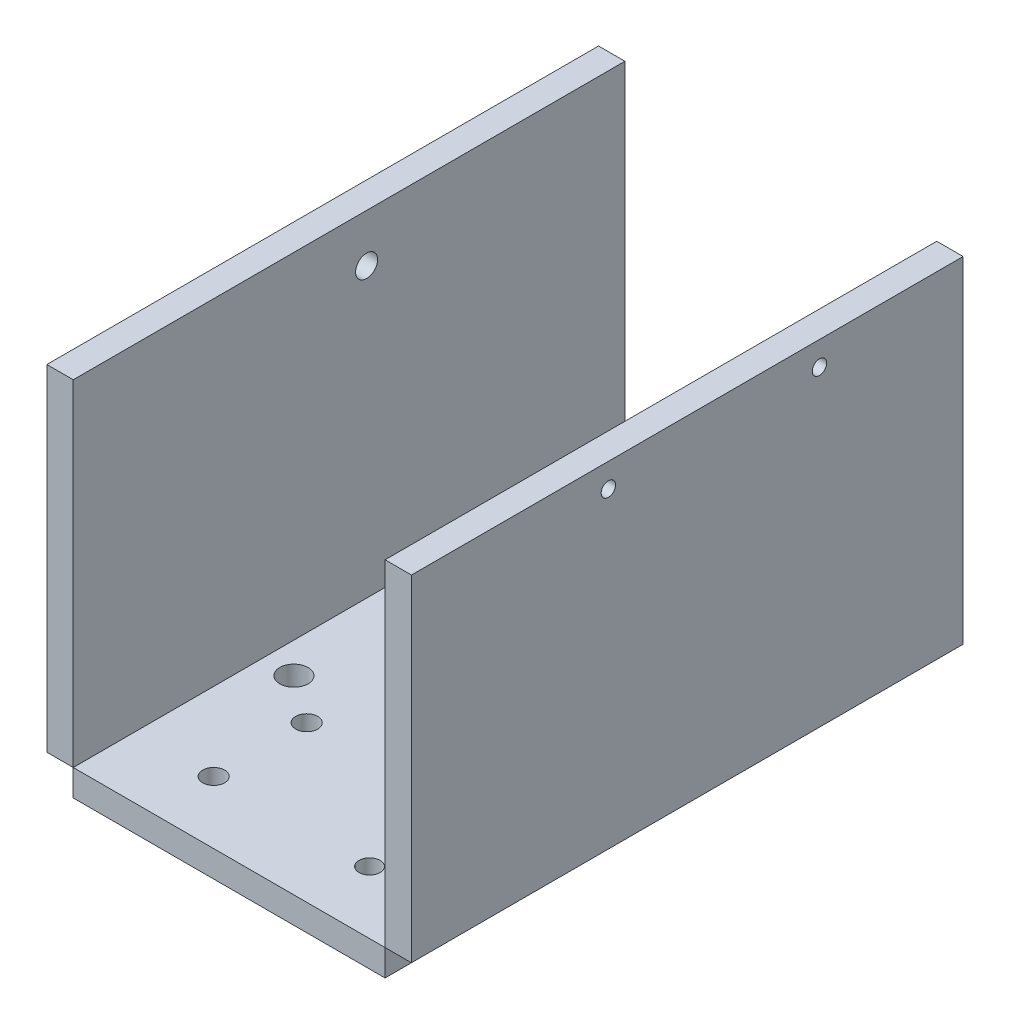
ISO-10303-21;
HEADER;
FILE_DESCRIPTION(('STEP AP214'),'2;1');
FILE_NAME('part.step','',(''),(''),'','','');
FILE_SCHEMA(('AUTOMOTIVE_DESIGN { 1 0 10303 214 1 1 1 1 }'));
ENDSEC;
DATA;
#1=APPLICATION_CONTEXT('core data for automotive mechanical design processes');
#2=APPLICATION_PROTOCOL_DEFINITION('international standard','automotive_design',2000,#1);
#3=PRODUCT_CONTEXT('',#1,'mechanical');
#4=PRODUCT('Part','Part','',(#3));
#5=PRODUCT_RELATED_PRODUCT_CATEGORY('part','',(#4));
#6=PRODUCT_DEFINITION_FORMATION('','',#4);
#7=PRODUCT_DEFINITION_CONTEXT('part definition',#1,'design');
#8=PRODUCT_DEFINITION('design','',#6,#7);
#9=PRODUCT_DEFINITION_SHAPE('','',#8);
#10=(LENGTH_UNIT() NAMED_UNIT(*) SI_UNIT(.MILLI.,.METRE.));
#11=(NAMED_UNIT(*) PLANE_ANGLE_UNIT() SI_UNIT($,.RADIAN.));
#12=(NAMED_UNIT(*) SI_UNIT($,.STERADIAN.) SOLID_ANGLE_UNIT());
#13=UNCERTAINTY_MEASURE_WITH_UNIT(LENGTH_MEASURE(1.E-05),#10,'distance_accuracy_value','');
#14=(GEOMETRIC_REPRESENTATION_CONTEXT(3) GLOBAL_UNCERTAINTY_ASSIGNED_CONTEXT((#13)) GLOBAL_UNIT_ASSIGNED_CONTEXT((#10,
#11,#12)) REPRESENTATION_CONTEXT('',''));
#15=CARTESIAN_POINT('',(0.,0.,0.));
#16=DIRECTION('',(0.,0.,1.));
#17=DIRECTION('',(1.,0.,0.));
#18=AXIS2_PLACEMENT_3D('',#15,#16,#17);
#19=CARTESIAN_POINT('',(70.5,5.5,0.));
#20=DIRECTION('',(0.,0.,1.));
#21=DIRECTION('',(1.,0.,0.));
#22=AXIS2_PLACEMENT_3D('',#19,#20,#21);
#23=PLANE('',#22);
#24=DIRECTION('',(0.,1.,0.));
#25=VECTOR('',#24,1.);
#26=CARTESIAN_POINT('',(65.,5.5,0.));
#27=LINE('',#26,#25);
#28=CARTESIAN_POINT('',(65.,5.5,0.));
#29=VERTEX_POINT('',#28);
#30=CARTESIAN_POINT('',(65.,75.5,0.));
#31=VERTEX_POINT('',#30);
#32=EDGE_CURVE('E107',#29,#31,#27,.T.);
#33=ORIENTED_EDGE('',*,*,#32,.T.);
#34=DIRECTION('',(-1.,0.,0.));
#35=VECTOR('',#34,1.);
#36=CARTESIAN_POINT('',(70.5,75.5,0.));
#37=LINE('',#36,#35);
#38=CARTESIAN_POINT('',(70.5,75.5,0.));
#39=VERTEX_POINT('',#38);
#40=EDGE_CURVE('E12',#39,#31,#37,.T.);
#41=ORIENTED_EDGE('',*,*,#40,.F.);
#42=DIRECTION('',(0.,1.,0.));
#43=VECTOR('',#42,1.);
#44=CARTESIAN_POINT('',(70.5,5.5,0.));
#45=LINE('',#44,#43);
#46=CARTESIAN_POINT('',(70.5,5.5,0.));
#47=VERTEX_POINT('',#46);
#48=EDGE_CURVE('E95',#47,#39,#45,.T.);
#49=ORIENTED_EDGE('',*,*,#48,.F.);
#50=DIRECTION('',(-1.,0.,0.));
#51=VECTOR('',#50,1.);
#52=CARTESIAN_POINT('',(70.5,5.5,0.));
#53=LINE('',#52,#51);
#54=EDGE_CURVE('E103',#47,#29,#53,.T.);
#55=ORIENTED_EDGE('',*,*,#54,.T.);
#56=EDGE_LOOP('',(#33,#41,#49,#55));
#57=FACE_BOUND('',#56,.T.);
#58=ADVANCED_FACE('F44',(#57),#23,.F.);
#59=CARTESIAN_POINT('',(70.5,75.5,0.));
#60=DIRECTION('',(0.,-1.,0.));
#61=DIRECTION('',(0.,0.,-1.));
#62=AXIS2_PLACEMENT_3D('',#59,#60,#61);
#63=PLANE('',#62);
#64=DIRECTION('',(0.,0.,1.));
#65=VECTOR('',#64,1.);
#66=CARTESIAN_POINT('',(65.,75.5,0.));
#67=LINE('',#66,#65);
#68=CARTESIAN_POINT('',(65.,75.5,115.));
#69=VERTEX_POINT('',#68);
#70=EDGE_CURVE('E99',#31,#69,#67,.T.);
#71=ORIENTED_EDGE('',*,*,#70,.T.);
#72=DIRECTION('',(-1.,0.,0.));
#73=VECTOR('',#72,1.);
#74=CARTESIAN_POINT('',(70.5,75.5,115.));
#75=LINE('',#74,#73);
#76=CARTESIAN_POINT('',(70.5,75.5,115.));
#77=VERTEX_POINT('',#76);
#78=EDGE_CURVE('E52',#77,#69,#75,.T.);
#79=ORIENTED_EDGE('',*,*,#78,.F.);
#80=DIRECTION('',(0.,0.,1.));
#81=VECTOR('',#80,1.);
#82=CARTESIAN_POINT('',(70.5,75.5,0.));
#83=LINE('',#82,#81);
#84=EDGE_CURVE('E90',#39,#77,#83,.T.);
#85=ORIENTED_EDGE('',*,*,#84,.F.);
#86=ORIENTED_EDGE('',*,*,#40,.T.);
#87=EDGE_LOOP('',(#71,#79,#85,#86));
#88=FACE_BOUND('',#87,.T.);
#89=ADVANCED_FACE('F98',(#88),#63,.F.);
#90=CARTESIAN_POINT('',(70.5,5.5,115.));
#91=DIRECTION('',(0.,0.,-1.));
#92=DIRECTION('',(-1.,0.,0.));
#93=AXIS2_PLACEMENT_3D('',#90,#91,#92);
#94=PLANE('',#93);
#95=DIRECTION('',(0.,-1.,0.));
#96=VECTOR('',#95,1.);
#97=CARTESIAN_POINT('',(65.,5.5,115.));
#98=LINE('',#97,#96);
#99=CARTESIAN_POINT('',(65.,5.5,115.));
#100=VERTEX_POINT('',#99);
#101=EDGE_CURVE('E77',#69,#100,#98,.T.);
#102=ORIENTED_EDGE('',*,*,#101,.T.);
#103=DIRECTION('',(-1.,0.,0.));
#104=VECTOR('',#103,1.);
#105=CARTESIAN_POINT('',(70.5,5.5,115.));
#106=LINE('',#105,#104);
#107=CARTESIAN_POINT('',(70.5,5.5,115.));
#108=VERTEX_POINT('',#107);
#109=EDGE_CURVE('E100',#108,#100,#106,.T.);
#110=ORIENTED_EDGE('',*,*,#109,.F.);
#111=DIRECTION('',(0.,-1.,0.));
#112=VECTOR('',#111,1.);
#113=CARTESIAN_POINT('',(70.5,5.5,115.));
#114=LINE('',#113,#112);
#115=EDGE_CURVE('E93',#77,#108,#114,.T.);
#116=ORIENTED_EDGE('',*,*,#115,.F.);
#117=ORIENTED_EDGE('',*,*,#78,.T.);
#118=EDGE_LOOP('',(#102,#110,#116,#117));
#119=FACE_BOUND('',#118,.T.);
#120=ADVANCED_FACE('F101',(#119),#94,.F.);
#121=CARTESIAN_POINT('',(70.5,5.5,0.));
#122=DIRECTION('',(0.,1.,0.));
#123=DIRECTION('',(0.,0.,1.));
#124=AXIS2_PLACEMENT_3D('',#121,#122,#123);
#125=PLANE('',#124);
#126=DIRECTION('',(0.,0.,-1.));
#127=VECTOR('',#126,1.);
#128=CARTESIAN_POINT('',(65.,5.5,0.));
#129=LINE('',#128,#127);
#130=EDGE_CURVE('E83',#100,#29,#129,.T.);
#131=ORIENTED_EDGE('',*,*,#130,.T.);
#132=ORIENTED_EDGE('',*,*,#54,.F.);
#133=DIRECTION('',(0.,0.,-1.));
#134=VECTOR('',#133,1.);
#135=CARTESIAN_POINT('',(70.5,5.5,0.));
#136=LINE('',#135,#134);
#137=EDGE_CURVE('E60',#108,#47,#136,.T.);
#138=ORIENTED_EDGE('',*,*,#137,.F.);
#139=ORIENTED_EDGE('',*,*,#109,.T.);
#140=EDGE_LOOP('',(#131,#132,#138,#139));
#141=FACE_BOUND('',#140,.T.);
#142=ADVANCED_FACE('F115',(#141),#125,.F.);
#143=CARTESIAN_POINT('',(70.5,0.,0.));
#144=DIRECTION('',(1.,0.,0.));
#145=DIRECTION('',(0.,0.,-1.));
#146=AXIS2_PLACEMENT_3D('',#143,#144,#145);
#147=PLANE('',#146);
#148=CARTESIAN_POINT('',(70.5,70.5,29.9504639657328));
#149=DIRECTION('',(-1.,0.,0.));
#150=DIRECTION('',(0.,0.,1.));
#151=AXIS2_PLACEMENT_3D('',#148,#149,#150);
#152=CIRCLE('',#151,1.50000000000001);
#153=CARTESIAN_POINT('',(70.5,70.5,31.4504639657328));
#154=VERTEX_POINT('',#153);
#155=EDGE_CURVE('E110',#154,#154,#152,.T.);
#156=ORIENTED_EDGE('',*,*,#155,.T.);
#157=EDGE_LOOP('',(#156));
#158=FACE_BOUND('',#157,.T.);
#159=CARTESIAN_POINT('',(70.5,70.5,73.9504639657328));
#160=DIRECTION('',(-1.,0.,0.));
#161=DIRECTION('',(0.,0.,1.));
#162=AXIS2_PLACEMENT_3D('',#159,#160,#161);
#163=CIRCLE('',#162,1.5);
#164=CARTESIAN_POINT('',(70.5,70.5,75.4504639657328));
#165=VERTEX_POINT('',#164);
#166=EDGE_CURVE('E124',#165,#165,#163,.T.);
#167=ORIENTED_EDGE('',*,*,#166,.T.);
#168=EDGE_LOOP('',(#167));
#169=FACE_BOUND('',#168,.T.);
#170=ORIENTED_EDGE('',*,*,#48,.T.);
#171=ORIENTED_EDGE('',*,*,#84,.T.);
#172=ORIENTED_EDGE('',*,*,#115,.T.);
#173=ORIENTED_EDGE('',*,*,#137,.T.);
#174=EDGE_LOOP('',(#170,#171,#172,#173));
#175=FACE_BOUND('',#174,.T.);
#176=ADVANCED_FACE('F91',(#158,#169,#175),#147,.T.);
#177=CARTESIAN_POINT('',(65.,0.,0.));
#178=DIRECTION('',(1.,0.,0.));
#179=DIRECTION('',(0.,0.,-1.));
#180=AXIS2_PLACEMENT_3D('',#177,#178,#179);
#181=PLANE('',#180);
#182=CARTESIAN_POINT('',(65.,70.5,29.9504639657328));
#183=DIRECTION('',(-1.,0.,0.));
#184=DIRECTION('',(0.,0.,1.));
#185=AXIS2_PLACEMENT_3D('',#182,#183,#184);
#186=CIRCLE('',#185,1.50000000000001);
#187=CARTESIAN_POINT('',(65.,70.5,31.4504639657328));
#188=VERTEX_POINT('',#187);
#189=EDGE_CURVE('E127',#188,#188,#186,.T.);
#190=ORIENTED_EDGE('',*,*,#189,.F.);
#191=EDGE_LOOP('',(#190));
#192=FACE_BOUND('',#191,.T.);
#193=CARTESIAN_POINT('',(65.,70.5,73.9504639657328));
#194=DIRECTION('',(-1.,0.,0.));
#195=DIRECTION('',(0.,0.,1.));
#196=AXIS2_PLACEMENT_3D('',#193,#194,#195);
#197=CIRCLE('',#196,1.5);
#198=CARTESIAN_POINT('',(65.,70.5,75.4504639657328));
#199=VERTEX_POINT('',#198);
#200=EDGE_CURVE('E121',#199,#199,#197,.T.);
#201=ORIENTED_EDGE('',*,*,#200,.F.);
#202=EDGE_LOOP('',(#201));
#203=FACE_BOUND('',#202,.T.);
#204=ORIENTED_EDGE('',*,*,#32,.F.);
#205=ORIENTED_EDGE('',*,*,#130,.F.);
#206=ORIENTED_EDGE('',*,*,#101,.F.);
#207=ORIENTED_EDGE('',*,*,#70,.F.);
#208=EDGE_LOOP('',(#204,#205,#206,#207));
#209=FACE_BOUND('',#208,.T.);
#210=ADVANCED_FACE('F118',(#192,#203,#209),#181,.F.);
#211=CARTESIAN_POINT('',(70.5,70.5,73.9504639657328));
#212=DIRECTION('',(-1.,0.,0.));
#213=DIRECTION('',(0.,0.,1.));
#214=AXIS2_PLACEMENT_3D('',#211,#212,#213);
#215=CYLINDRICAL_SURFACE('',#214,1.5);
#216=ORIENTED_EDGE('',*,*,#166,.F.);
#217=EDGE_LOOP('',(#216));
#218=FACE_BOUND('',#217,.T.);
#219=ORIENTED_EDGE('',*,*,#200,.T.);
#220=EDGE_LOOP('',(#219));
#221=FACE_BOUND('',#220,.T.);
#222=ADVANCED_FACE('F138',(#218,#221),#215,.F.);
#223=CARTESIAN_POINT('',(70.5,70.5,29.9504639657328));
#224=DIRECTION('',(-1.,0.,0.));
#225=DIRECTION('',(0.,0.,1.));
#226=AXIS2_PLACEMENT_3D('',#223,#224,#225);
#227=CYLINDRICAL_SURFACE('',#226,1.50000000000001);
#228=ORIENTED_EDGE('',*,*,#155,.F.);
#229=EDGE_LOOP('',(#228));
#230=FACE_BOUND('',#229,.T.);
#231=ORIENTED_EDGE('',*,*,#189,.T.);
#232=EDGE_LOOP('',(#231));
#233=FACE_BOUND('',#232,.T.);
#234=ADVANCED_FACE('F135',(#230,#233),#227,.F.);
#235=CLOSED_SHELL('',(#58,#89,#120,#142,#176,#210,#222,#234));
#236=MANIFOLD_SOLID_BREP('B2',#235);
#237=CARTESIAN_POINT('',(-5.49999999999996,5.5,115.));
#238=DIRECTION('',(0.,0.,-1.));
#239=DIRECTION('',(-1.,0.,0.));
#240=AXIS2_PLACEMENT_3D('',#237,#238,#239);
#241=PLANE('',#240);
#242=DIRECTION('',(0.,1.,0.));
#243=VECTOR('',#242,1.);
#244=CARTESIAN_POINT('',(0.,5.5,115.));
#245=LINE('',#244,#243);
#246=CARTESIAN_POINT('',(0.,5.5,115.));
#247=VERTEX_POINT('',#246);
#248=CARTESIAN_POINT('',(0.,75.5,115.));
#249=VERTEX_POINT('',#248);
#250=EDGE_CURVE('E282',#247,#249,#245,.T.);
#251=ORIENTED_EDGE('',*,*,#250,.T.);
#252=DIRECTION('',(1.,0.,0.));
#253=VECTOR('',#252,1.);
#254=CARTESIAN_POINT('',(-5.49999999999996,75.5,115.));
#255=LINE('',#254,#253);
#256=CARTESIAN_POINT('',(-5.49999999999996,75.5,115.));
#257=VERTEX_POINT('',#256);
#258=EDGE_CURVE('E42',#257,#249,#255,.T.);
#259=ORIENTED_EDGE('',*,*,#258,.F.);
#260=DIRECTION('',(0.,1.,0.));
#261=VECTOR('',#260,1.);
#262=CARTESIAN_POINT('',(-5.49999999999996,5.5,115.));
#263=LINE('',#262,#261);
#264=CARTESIAN_POINT('',(-5.49999999999996,5.5,115.));
#265=VERTEX_POINT('',#264);
#266=EDGE_CURVE('E270',#265,#257,#263,.T.);
#267=ORIENTED_EDGE('',*,*,#266,.F.);
#268=DIRECTION('',(1.,0.,0.));
#269=VECTOR('',#268,1.);
#270=CARTESIAN_POINT('',(-5.49999999999996,5.5,115.));
#271=LINE('',#270,#269);
#272=EDGE_CURVE('E278',#265,#247,#271,.T.);
#273=ORIENTED_EDGE('',*,*,#272,.T.);
#274=EDGE_LOOP('',(#251,#259,#267,#273));
#275=FACE_BOUND('',#274,.T.);
#276=ADVANCED_FACE('F219',(#275),#241,.F.);
#277=CARTESIAN_POINT('',(-5.49999999999996,75.5,115.));
#278=DIRECTION('',(0.,-1.,0.));
#279=DIRECTION('',(0.,0.,-1.));
#280=AXIS2_PLACEMENT_3D('',#277,#278,#279);
#281=PLANE('',#280);
#282=DIRECTION('',(0.,0.,-1.));
#283=VECTOR('',#282,1.);
#284=CARTESIAN_POINT('',(0.,75.5,115.));
#285=LINE('',#284,#283);
#286=CARTESIAN_POINT('',(0.,75.5,0.));
#287=VERTEX_POINT('',#286);
#288=EDGE_CURVE('E274',#249,#287,#285,.T.);
#289=ORIENTED_EDGE('',*,*,#288,.T.);
#290=DIRECTION('',(1.,0.,0.));
#291=VECTOR('',#290,1.);
#292=CARTESIAN_POINT('',(-5.5,75.5,0.));
#293=LINE('',#292,#291);
#294=CARTESIAN_POINT('',(-5.5,75.5,0.));
#295=VERTEX_POINT('',#294);
#296=EDGE_CURVE('E227',#295,#287,#293,.T.);
#297=ORIENTED_EDGE('',*,*,#296,.F.);
#298=DIRECTION('',(0.,0.,-1.));
#299=VECTOR('',#298,1.);
#300=CARTESIAN_POINT('',(-5.49999999999996,75.5,115.));
#301=LINE('',#300,#299);
#302=EDGE_CURVE('E265',#257,#295,#301,.T.);
#303=ORIENTED_EDGE('',*,*,#302,.F.);
#304=ORIENTED_EDGE('',*,*,#258,.T.);
#305=EDGE_LOOP('',(#289,#297,#303,#304));
#306=FACE_BOUND('',#305,.T.);
#307=ADVANCED_FACE('F273',(#306),#281,.F.);
#308=CARTESIAN_POINT('',(-5.5,5.5,0.));
#309=DIRECTION('',(0.,0.,1.));
#310=DIRECTION('',(1.,0.,0.));
#311=AXIS2_PLACEMENT_3D('',#308,#309,#310);
#312=PLANE('',#311);
#313=DIRECTION('',(0.,-1.,0.));
#314=VECTOR('',#313,1.);
#315=CARTESIAN_POINT('',(0.,5.5,0.));
#316=LINE('',#315,#314);
#317=CARTESIAN_POINT('',(0.,5.5,0.));
#318=VERTEX_POINT('',#317);
#319=EDGE_CURVE('E252',#287,#318,#316,.T.);
#320=ORIENTED_EDGE('',*,*,#319,.T.);
#321=DIRECTION('',(1.,0.,0.));
#322=VECTOR('',#321,1.);
#323=CARTESIAN_POINT('',(-5.5,5.5,0.));
#324=LINE('',#323,#322);
#325=CARTESIAN_POINT('',(-5.5,5.5,0.));
#326=VERTEX_POINT('',#325);
#327=EDGE_CURVE('E275',#326,#318,#324,.T.);
#328=ORIENTED_EDGE('',*,*,#327,.F.);
#329=DIRECTION('',(0.,-1.,0.));
#330=VECTOR('',#329,1.);
#331=CARTESIAN_POINT('',(-5.5,5.5,0.));
#332=LINE('',#331,#330);
#333=EDGE_CURVE('E268',#295,#326,#332,.T.);
#334=ORIENTED_EDGE('',*,*,#333,.F.);
#335=ORIENTED_EDGE('',*,*,#296,.T.);
#336=EDGE_LOOP('',(#320,#328,#334,#335));
#337=FACE_BOUND('',#336,.T.);
#338=ADVANCED_FACE('F276',(#337),#312,.F.);
#339=CARTESIAN_POINT('',(-5.49999999999996,5.5,115.));
#340=DIRECTION('',(0.,1.,0.));
#341=DIRECTION('',(0.,0.,1.));
#342=AXIS2_PLACEMENT_3D('',#339,#340,#341);
#343=PLANE('',#342);
#344=DIRECTION('',(0.,0.,1.));
#345=VECTOR('',#344,1.);
#346=CARTESIAN_POINT('',(0.,5.5,115.));
#347=LINE('',#346,#345);
#348=EDGE_CURVE('E258',#318,#247,#347,.T.);
#349=ORIENTED_EDGE('',*,*,#348,.T.);
#350=ORIENTED_EDGE('',*,*,#272,.F.);
#351=DIRECTION('',(0.,0.,1.));
#352=VECTOR('',#351,1.);
#353=CARTESIAN_POINT('',(-5.49999999999996,5.5,115.));
#354=LINE('',#353,#352);
#355=EDGE_CURVE('E235',#326,#265,#354,.T.);
#356=ORIENTED_EDGE('',*,*,#355,.F.);
#357=ORIENTED_EDGE('',*,*,#327,.T.);
#358=EDGE_LOOP('',(#349,#350,#356,#357));
#359=FACE_BOUND('',#358,.T.);
#360=ADVANCED_FACE('F290',(#359),#343,.F.);
#361=CARTESIAN_POINT('',(-5.5,0.,0.));
#362=DIRECTION('',(-1.,0.,0.));
#363=DIRECTION('',(0.,0.,1.));
#364=AXIS2_PLACEMENT_3D('',#361,#362,#363);
#365=PLANE('',#364);
#366=CARTESIAN_POINT('',(-5.49999999999998,65.5,53.8493906762634));
#367=DIRECTION('',(-1.,0.,0.));
#368=DIRECTION('',(0.,0.,1.));
#369=AXIS2_PLACEMENT_3D('',#366,#367,#368);
#370=CIRCLE('',#369,2.3);
#371=CARTESIAN_POINT('',(-5.49999999999998,65.5,56.1493906762634));
#372=VERTEX_POINT('',#371);
#373=EDGE_CURVE('E296',#372,#372,#370,.T.);
#374=ORIENTED_EDGE('',*,*,#373,.F.);
#375=EDGE_LOOP('',(#374));
#376=FACE_BOUND('',#375,.T.);
#377=ORIENTED_EDGE('',*,*,#266,.T.);
#378=ORIENTED_EDGE('',*,*,#302,.T.);
#379=ORIENTED_EDGE('',*,*,#333,.T.);
#380=ORIENTED_EDGE('',*,*,#355,.T.);
#381=EDGE_LOOP('',(#377,#378,#379,#380));
#382=FACE_BOUND('',#381,.T.);
#383=ADVANCED_FACE('F266',(#376,#382),#365,.T.);
#384=CARTESIAN_POINT('',(0.,0.,0.));
#385=DIRECTION('',(-1.,0.,0.));
#386=DIRECTION('',(0.,0.,1.));
#387=AXIS2_PLACEMENT_3D('',#384,#385,#386);
#388=PLANE('',#387);
#389=CARTESIAN_POINT('',(0.,65.5,53.8493906762634));
#390=DIRECTION('',(-1.,0.,0.));
#391=DIRECTION('',(0.,0.,1.));
#392=AXIS2_PLACEMENT_3D('',#389,#390,#391);
#393=CIRCLE('',#392,2.3);
#394=CARTESIAN_POINT('',(0.,65.5,56.1493906762634));
#395=VERTEX_POINT('',#394);
#396=EDGE_CURVE('E285',#395,#395,#393,.T.);
#397=ORIENTED_EDGE('',*,*,#396,.T.);
#398=EDGE_LOOP('',(#397));
#399=FACE_BOUND('',#398,.T.);
#400=ORIENTED_EDGE('',*,*,#250,.F.);
#401=ORIENTED_EDGE('',*,*,#348,.F.);
#402=ORIENTED_EDGE('',*,*,#319,.F.);
#403=ORIENTED_EDGE('',*,*,#288,.F.);
#404=EDGE_LOOP('',(#400,#401,#402,#403));
#405=FACE_BOUND('',#404,.T.);
#406=ADVANCED_FACE('F293',(#399,#405),#388,.F.);
#407=CARTESIAN_POINT('',(0.,65.5,53.8493906762634));
#408=DIRECTION('',(-1.,0.,0.));
#409=DIRECTION('',(0.,0.,1.));
#410=AXIS2_PLACEMENT_3D('',#407,#408,#409);
#411=CYLINDRICAL_SURFACE('',#410,2.3);
#412=ORIENTED_EDGE('',*,*,#396,.F.);
#413=EDGE_LOOP('',(#412));
#414=FACE_BOUND('',#413,.T.);
#415=ORIENTED_EDGE('',*,*,#373,.T.);
#416=EDGE_LOOP('',(#415));
#417=FACE_BOUND('',#416,.T.);
#418=ADVANCED_FACE('F303',(#414,#417),#411,.F.);
#419=CLOSED_SHELL('',(#276,#307,#338,#360,#383,#406,#418));
#420=MANIFOLD_SOLID_BREP('B6',#419);
#421=CARTESIAN_POINT('',(0.,5.5,0.));
#422=DIRECTION('',(0.,1.,0.));
#423=DIRECTION('',(0.,0.,1.));
#424=AXIS2_PLACEMENT_3D('',#421,#422,#423);
#425=PLANE('',#424);
#426=CARTESIAN_POINT('',(24.2646895055998,5.5,3.57255256062672));
#427=DIRECTION('',(0.,1.,0.));
#428=DIRECTION('',(0.,0.,1.));
#429=AXIS2_PLACEMENT_3D('',#426,#427,#428);
#430=CIRCLE('',#429,1.62696087913636);
#431=CARTESIAN_POINT('',(24.2646895055998,5.5,5.19951343976308));
#432=VERTEX_POINT('',#431);
#433=EDGE_CURVE('E515',#432,#432,#430,.T.);
#434=ORIENTED_EDGE('',*,*,#433,.F.);
#435=EDGE_LOOP('',(#434));
#436=FACE_BOUND('',#435,.T.);
#437=CARTESIAN_POINT('',(30.7646895055998,5.5,3.57255256062672));
#438=DIRECTION('',(0.,1.,0.));
#439=DIRECTION('',(0.,0.,1.));
#440=AXIS2_PLACEMENT_3D('',#437,#438,#439);
#441=CIRCLE('',#440,1.62696087913636);
#442=CARTESIAN_POINT('',(30.7646895055998,5.5,5.19951343976307));
#443=VERTEX_POINT('',#442);
#444=EDGE_CURVE('E509',#443,#443,#441,.T.);
#445=ORIENTED_EDGE('',*,*,#444,.F.);
#446=EDGE_LOOP('',(#445));
#447=FACE_BOUND('',#446,.T.);
#448=CARTESIAN_POINT('',(37.2646895055998,5.5,3.57255256062672));
#449=DIRECTION('',(0.,1.,0.));
#450=DIRECTION('',(0.,0.,1.));
#451=AXIS2_PLACEMENT_3D('',#448,#449,#450);
#452=CIRCLE('',#451,1.62696087913636);
#453=CARTESIAN_POINT('',(37.2646895055998,5.5,5.19951343976307));
#454=VERTEX_POINT('',#453);
#455=EDGE_CURVE('E503',#454,#454,#452,.T.);
#456=ORIENTED_EDGE('',*,*,#455,.F.);
#457=EDGE_LOOP('',(#456));
#458=FACE_BOUND('',#457,.T.);
#459=CARTESIAN_POINT('',(55.6385938977062,5.5,75.4209438330093));
#460=DIRECTION('',(0.,1.,0.));
#461=DIRECTION('',(0.,0.,1.));
#462=AXIS2_PLACEMENT_3D('',#459,#460,#461);
#463=CIRCLE('',#462,3.11714683503613);
#464=CARTESIAN_POINT('',(55.6385938977062,5.5,78.5380906680455));
#465=VERTEX_POINT('',#464);
#466=EDGE_CURVE('E498',#465,#465,#463,.T.);
#467=ORIENTED_EDGE('',*,*,#466,.F.);
#468=EDGE_LOOP('',(#467));
#469=FACE_BOUND('',#468,.T.);
#470=CARTESIAN_POINT('',(6.41957795824055,5.5,75.4209438330093));
#471=DIRECTION('',(0.,1.,0.));
#472=DIRECTION('',(0.,0.,1.));
#473=AXIS2_PLACEMENT_3D('',#470,#471,#472);
#474=CIRCLE('',#473,2.95780841661133);
#475=CARTESIAN_POINT('',(6.41957795824055,5.5,78.3787522496207));
#476=VERTEX_POINT('',#475);
#477=EDGE_CURVE('E491',#476,#476,#474,.T.);
#478=ORIENTED_EDGE('',*,*,#477,.F.);
#479=EDGE_LOOP('',(#478));
#480=FACE_BOUND('',#479,.T.);
#481=CARTESIAN_POINT('',(48.75,5.5,101.976725705829));
#482=DIRECTION('',(0.,1.,0.));
#483=DIRECTION('',(0.,0.,-1.));
#484=AXIS2_PLACEMENT_3D('',#481,#482,#483);
#485=CIRCLE('',#484,2.2);
#486=CARTESIAN_POINT('',(48.75,5.5,99.7767257058291));
#487=VERTEX_POINT('',#486);
#488=EDGE_CURVE('E476',#487,#487,#485,.T.);
#489=ORIENTED_EDGE('',*,*,#488,.F.);
#490=EDGE_LOOP('',(#489));
#491=FACE_BOUND('',#490,.T.);
#492=CARTESIAN_POINT('',(16.25,5.5,82.5875242467693));
#493=DIRECTION('',(0.,1.,0.));
#494=DIRECTION('',(0.,0.,1.));
#495=AXIS2_PLACEMENT_3D('',#492,#493,#494);
#496=CIRCLE('',#495,2.3);
#497=CARTESIAN_POINT('',(16.25,5.5,84.8875242467693));
#498=VERTEX_POINT('',#497);
#499=EDGE_CURVE('E464',#498,#498,#496,.T.);
#500=ORIENTED_EDGE('',*,*,#499,.F.);
#501=EDGE_LOOP('',(#500));
#502=FACE_BOUND('',#501,.T.);
#503=CARTESIAN_POINT('',(48.75,5.5,18.6842660701551));
#504=DIRECTION('',(0.,1.,0.));
#505=DIRECTION('',(0.,0.,-1.));
#506=AXIS2_PLACEMENT_3D('',#503,#504,#505);
#507=CIRCLE('',#506,2.3);
#508=CARTESIAN_POINT('',(48.75,5.5,16.3842660701551));
#509=VERTEX_POINT('',#508);
#510=EDGE_CURVE('E452',#509,#509,#507,.T.);
#511=ORIENTED_EDGE('',*,*,#510,.F.);
#512=EDGE_LOOP('',(#511));
#513=FACE_BOUND('',#512,.T.);
#514=CARTESIAN_POINT('',(16.25,5.5,6.2280886900517));
#515=DIRECTION('',(0.,1.,0.));
#516=DIRECTION('',(0.,0.,1.));
#517=AXIS2_PLACEMENT_3D('',#514,#515,#516);
#518=CIRCLE('',#517,2.3);
#519=CARTESIAN_POINT('',(16.25,5.5,8.5280886900517));
#520=VERTEX_POINT('',#519);
#521=EDGE_CURVE('E431',#520,#520,#518,.T.);
#522=ORIENTED_EDGE('',*,*,#521,.F.);
#523=EDGE_LOOP('',(#522));
#524=FACE_BOUND('',#523,.T.);
#525=DIRECTION('',(0.,0.,1.));
#526=VECTOR('',#525,1.);
#527=CARTESIAN_POINT('',(0.,5.5,0.));
#528=LINE('',#527,#526);
#529=CARTESIAN_POINT('',(0.,5.5,0.));
#530=VERTEX_POINT('',#529);
#531=CARTESIAN_POINT('',(0.,5.5,115.));
#532=VERTEX_POINT('',#531);
#533=EDGE_CURVE('E416',#530,#532,#528,.T.);
#534=ORIENTED_EDGE('',*,*,#533,.T.);
#535=DIRECTION('',(1.,0.,0.));
#536=VECTOR('',#535,1.);
#537=CARTESIAN_POINT('',(0.,5.5,115.));
#538=LINE('',#537,#536);
#539=CARTESIAN_POINT('',(65.,5.5,115.));
#540=VERTEX_POINT('',#539);
#541=EDGE_CURVE('E411',#532,#540,#538,.T.);
#542=ORIENTED_EDGE('',*,*,#541,.T.);
#543=DIRECTION('',(0.,0.,-1.));
#544=VECTOR('',#543,1.);
#545=CARTESIAN_POINT('',(65.,5.5,0.));
#546=LINE('',#545,#544);
#547=CARTESIAN_POINT('',(65.,5.5,0.));
#548=VERTEX_POINT('',#547);
#549=EDGE_CURVE('E414',#540,#548,#546,.T.);
#550=ORIENTED_EDGE('',*,*,#549,.T.);
#551=DIRECTION('',(-1.,0.,0.));
#552=VECTOR('',#551,1.);
#553=CARTESIAN_POINT('',(0.,5.5,0.));
#554=LINE('',#553,#552);
#555=EDGE_CURVE('E381',#548,#530,#554,.T.);
#556=ORIENTED_EDGE('',*,*,#555,.T.);
#557=EDGE_LOOP('',(#534,#542,#550,#556));
#558=FACE_BOUND('',#557,.T.);
#559=CARTESIAN_POINT('',(48.75,5.5,6.2280886900517));
#560=DIRECTION('',(0.,1.,0.));
#561=DIRECTION('',(0.,0.,1.));
#562=AXIS2_PLACEMENT_3D('',#559,#560,#561);
#563=CIRCLE('',#562,2.3);
#564=CARTESIAN_POINT('',(48.75,5.5,8.5280886900517));
#565=VERTEX_POINT('',#564);
#566=EDGE_CURVE('E446',#565,#565,#563,.T.);
#567=ORIENTED_EDGE('',*,*,#566,.F.);
#568=EDGE_LOOP('',(#567));
#569=FACE_BOUND('',#568,.T.);
#570=CARTESIAN_POINT('',(16.25,5.5,18.6842660701551));
#571=DIRECTION('',(0.,1.,0.));
#572=DIRECTION('',(0.,0.,-1.));
#573=AXIS2_PLACEMENT_3D('',#570,#571,#572);
#574=CIRCLE('',#573,2.3);
#575=CARTESIAN_POINT('',(16.25,5.5,16.3842660701551));
#576=VERTEX_POINT('',#575);
#577=EDGE_CURVE('E458',#576,#576,#574,.T.);
#578=ORIENTED_EDGE('',*,*,#577,.F.);
#579=EDGE_LOOP('',(#578));
#580=FACE_BOUND('',#579,.T.);
#581=CARTESIAN_POINT('',(48.75,5.5,82.5875242467693));
#582=DIRECTION('',(0.,1.,0.));
#583=DIRECTION('',(0.,0.,1.));
#584=AXIS2_PLACEMENT_3D('',#581,#582,#583);
#585=CIRCLE('',#584,2.2);
#586=CARTESIAN_POINT('',(48.75,5.5,84.7875242467693));
#587=VERTEX_POINT('',#586);
#588=EDGE_CURVE('E470',#587,#587,#585,.T.);
#589=ORIENTED_EDGE('',*,*,#588,.F.);
#590=EDGE_LOOP('',(#589));
#591=FACE_BOUND('',#590,.T.);
#592=CARTESIAN_POINT('',(16.25,5.5,101.976725705829));
#593=DIRECTION('',(0.,1.,0.));
#594=DIRECTION('',(0.,0.,-1.));
#595=AXIS2_PLACEMENT_3D('',#592,#593,#594);
#596=CIRCLE('',#595,2.3);
#597=CARTESIAN_POINT('',(16.25,5.5,99.6767257058291));
#598=VERTEX_POINT('',#597);
#599=EDGE_CURVE('E482',#598,#598,#596,.T.);
#600=ORIENTED_EDGE('',*,*,#599,.F.);
#601=EDGE_LOOP('',(#600));
#602=FACE_BOUND('',#601,.T.);
#603=ADVANCED_FACE('F364',(#436,#447,#458,#469,#480,#491,#502,#513,#524,#558,#569,#580,#591,
#602),#425,.T.);
#604=CARTESIAN_POINT('',(0.,0.,0.));
#605=DIRECTION('',(0.,1.,0.));
#606=DIRECTION('',(0.,0.,1.));
#607=AXIS2_PLACEMENT_3D('',#604,#605,#606);
#608=PLANE('',#607);
#609=CARTESIAN_POINT('',(24.2646895055998,0.,3.57255256062672));
#610=DIRECTION('',(0.,1.,0.));
#611=DIRECTION('',(0.,0.,1.));
#612=AXIS2_PLACEMENT_3D('',#609,#610,#611);
#613=CIRCLE('',#612,1.62696087913636);
#614=CARTESIAN_POINT('',(24.2646895055998,0.,5.19951343976308));
#615=VERTEX_POINT('',#614);
#616=EDGE_CURVE('E495',#615,#615,#613,.T.);
#617=ORIENTED_EDGE('',*,*,#616,.T.);
#618=EDGE_LOOP('',(#617));
#619=FACE_BOUND('',#618,.T.);
#620=CARTESIAN_POINT('',(30.7646895055998,0.,3.57255256062672));
#621=DIRECTION('',(0.,1.,0.));
#622=DIRECTION('',(0.,0.,1.));
#623=AXIS2_PLACEMENT_3D('',#620,#621,#622);
#624=CIRCLE('',#623,1.62696087913636);
#625=CARTESIAN_POINT('',(30.7646895055998,0.,5.19951343976307));
#626=VERTEX_POINT('',#625);
#627=EDGE_CURVE('E512',#626,#626,#624,.T.);
#628=ORIENTED_EDGE('',*,*,#627,.T.);
#629=EDGE_LOOP('',(#628));
#630=FACE_BOUND('',#629,.T.);
#631=CARTESIAN_POINT('',(37.2646895055998,0.,3.57255256062672));
#632=DIRECTION('',(0.,1.,0.));
#633=DIRECTION('',(0.,0.,1.));
#634=AXIS2_PLACEMENT_3D('',#631,#632,#633);
#635=CIRCLE('',#634,1.62696087913636);
#636=CARTESIAN_POINT('',(37.2646895055998,0.,5.19951343976307));
#637=VERTEX_POINT('',#636);
#638=EDGE_CURVE('E506',#637,#637,#635,.T.);
#639=ORIENTED_EDGE('',*,*,#638,.T.);
#640=EDGE_LOOP('',(#639));
#641=FACE_BOUND('',#640,.T.);
#642=CARTESIAN_POINT('',(55.6385938977062,0.,75.4209438330093));
#643=DIRECTION('',(0.,1.,0.));
#644=DIRECTION('',(0.,0.,1.));
#645=AXIS2_PLACEMENT_3D('',#642,#643,#644);
#646=CIRCLE('',#645,3.11714683503613);
#647=CARTESIAN_POINT('',(55.6385938977062,0.,78.5380906680455));
#648=VERTEX_POINT('',#647);
#649=EDGE_CURVE('E488',#648,#648,#646,.T.);
#650=ORIENTED_EDGE('',*,*,#649,.T.);
#651=EDGE_LOOP('',(#650));
#652=FACE_BOUND('',#651,.T.);
#653=CARTESIAN_POINT('',(6.41957795824055,0.,75.4209438330093));
#654=DIRECTION('',(0.,1.,0.));
#655=DIRECTION('',(0.,0.,1.));
#656=AXIS2_PLACEMENT_3D('',#653,#654,#655);
#657=CIRCLE('',#656,2.95780841661133);
#658=CARTESIAN_POINT('',(6.41957795824055,0.,78.3787522496207));
#659=VERTEX_POINT('',#658);
#660=EDGE_CURVE('E494',#659,#659,#657,.T.);
#661=ORIENTED_EDGE('',*,*,#660,.T.);
#662=EDGE_LOOP('',(#661));
#663=FACE_BOUND('',#662,.T.);
#664=DIRECTION('',(0.,0.,1.));
#665=VECTOR('',#664,1.);
#666=CARTESIAN_POINT('',(0.,0.,0.));
#667=LINE('',#666,#665);
#668=CARTESIAN_POINT('',(0.,0.,0.));
#669=VERTEX_POINT('',#668);
#670=CARTESIAN_POINT('',(0.,0.,115.));
#671=VERTEX_POINT('',#670);
#672=EDGE_CURVE('E428',#669,#671,#667,.T.);
#673=ORIENTED_EDGE('',*,*,#672,.F.);
#674=DIRECTION('',(-1.,0.,0.));
#675=VECTOR('',#674,1.);
#676=CARTESIAN_POINT('',(0.,0.,0.));
#677=LINE('',#676,#675);
#678=CARTESIAN_POINT('',(65.,0.,0.));
#679=VERTEX_POINT('',#678);
#680=EDGE_CURVE('E404',#679,#669,#677,.T.);
#681=ORIENTED_EDGE('',*,*,#680,.F.);
#682=DIRECTION('',(0.,0.,-1.));
#683=VECTOR('',#682,1.);
#684=CARTESIAN_POINT('',(65.,0.,0.));
#685=LINE('',#684,#683);
#686=CARTESIAN_POINT('',(65.,0.,115.));
#687=VERTEX_POINT('',#686);
#688=EDGE_CURVE('E398',#687,#679,#685,.T.);
#689=ORIENTED_EDGE('',*,*,#688,.F.);
#690=DIRECTION('',(1.,0.,0.));
#691=VECTOR('',#690,1.);
#692=CARTESIAN_POINT('',(0.,0.,115.));
#693=LINE('',#692,#691);
#694=EDGE_CURVE('E420',#671,#687,#693,.T.);
#695=ORIENTED_EDGE('',*,*,#694,.F.);
#696=EDGE_LOOP('',(#673,#681,#689,#695));
#697=FACE_BOUND('',#696,.T.);
#698=CARTESIAN_POINT('',(16.25,0.,6.2280886900517));
#699=DIRECTION('',(0.,1.,0.));
#700=DIRECTION('',(0.,0.,1.));
#701=AXIS2_PLACEMENT_3D('',#698,#699,#700);
#702=CIRCLE('',#701,2.3);
#703=CARTESIAN_POINT('',(16.25,0.,8.5280886900517));
#704=VERTEX_POINT('',#703);
#705=EDGE_CURVE('E443',#704,#704,#702,.T.);
#706=ORIENTED_EDGE('',*,*,#705,.T.);
#707=EDGE_LOOP('',(#706));
#708=FACE_BOUND('',#707,.T.);
#709=CARTESIAN_POINT('',(48.75,0.,6.2280886900517));
#710=DIRECTION('',(0.,1.,0.));
#711=DIRECTION('',(0.,0.,1.));
#712=AXIS2_PLACEMENT_3D('',#709,#710,#711);
#713=CIRCLE('',#712,2.3);
#714=CARTESIAN_POINT('',(48.75,0.,8.5280886900517));
#715=VERTEX_POINT('',#714);
#716=EDGE_CURVE('E449',#715,#715,#713,.T.);
#717=ORIENTED_EDGE('',*,*,#716,.T.);
#718=EDGE_LOOP('',(#717));
#719=FACE_BOUND('',#718,.T.);
#720=CARTESIAN_POINT('',(48.75,0.,18.6842660701551));
#721=DIRECTION('',(0.,1.,0.));
#722=DIRECTION('',(0.,0.,-1.));
#723=AXIS2_PLACEMENT_3D('',#720,#721,#722);
#724=CIRCLE('',#723,2.3);
#725=CARTESIAN_POINT('',(48.75,0.,16.3842660701551));
#726=VERTEX_POINT('',#725);
#727=EDGE_CURVE('E455',#726,#726,#724,.T.);
#728=ORIENTED_EDGE('',*,*,#727,.T.);
#729=EDGE_LOOP('',(#728));
#730=FACE_BOUND('',#729,.T.);
#731=CARTESIAN_POINT('',(16.25,0.,18.6842660701551));
#732=DIRECTION('',(0.,1.,0.));
#733=DIRECTION('',(0.,0.,-1.));
#734=AXIS2_PLACEMENT_3D('',#731,#732,#733);
#735=CIRCLE('',#734,2.3);
#736=CARTESIAN_POINT('',(16.25,0.,16.3842660701551));
#737=VERTEX_POINT('',#736);
#738=EDGE_CURVE('E461',#737,#737,#735,.T.);
#739=ORIENTED_EDGE('',*,*,#738,.T.);
#740=EDGE_LOOP('',(#739));
#741=FACE_BOUND('',#740,.T.);
#742=CARTESIAN_POINT('',(16.25,0.,82.5875242467693));
#743=DIRECTION('',(0.,1.,0.));
#744=DIRECTION('',(0.,0.,1.));
#745=AXIS2_PLACEMENT_3D('',#742,#743,#744);
#746=CIRCLE('',#745,2.3);
#747=CARTESIAN_POINT('',(16.25,0.,84.8875242467693));
#748=VERTEX_POINT('',#747);
#749=EDGE_CURVE('E467',#748,#748,#746,.T.);
#750=ORIENTED_EDGE('',*,*,#749,.T.);
#751=EDGE_LOOP('',(#750));
#752=FACE_BOUND('',#751,.T.);
#753=CARTESIAN_POINT('',(48.75,0.,82.5875242467693));
#754=DIRECTION('',(0.,1.,0.));
#755=DIRECTION('',(0.,0.,1.));
#756=AXIS2_PLACEMENT_3D('',#753,#754,#755);
#757=CIRCLE('',#756,2.2);
#758=CARTESIAN_POINT('',(48.75,0.,84.7875242467693));
#759=VERTEX_POINT('',#758);
#760=EDGE_CURVE('E473',#759,#759,#757,.T.);
#761=ORIENTED_EDGE('',*,*,#760,.T.);
#762=EDGE_LOOP('',(#761));
#763=FACE_BOUND('',#762,.T.);
#764=CARTESIAN_POINT('',(48.75,0.,101.976725705829));
#765=DIRECTION('',(0.,1.,0.));
#766=DIRECTION('',(0.,0.,-1.));
#767=AXIS2_PLACEMENT_3D('',#764,#765,#766);
#768=CIRCLE('',#767,2.2);
#769=CARTESIAN_POINT('',(48.75,0.,99.7767257058291));
#770=VERTEX_POINT('',#769);
#771=EDGE_CURVE('E479',#770,#770,#768,.T.);
#772=ORIENTED_EDGE('',*,*,#771,.T.);
#773=EDGE_LOOP('',(#772));
#774=FACE_BOUND('',#773,.T.);
#775=CARTESIAN_POINT('',(16.25,0.,101.976725705829));
#776=DIRECTION('',(0.,1.,0.));
#777=DIRECTION('',(0.,0.,-1.));
#778=AXIS2_PLACEMENT_3D('',#775,#776,#777);
#779=CIRCLE('',#778,2.3);
#780=CARTESIAN_POINT('',(16.25,0.,99.6767257058291));
#781=VERTEX_POINT('',#780);
#782=EDGE_CURVE('E485',#781,#781,#779,.T.);
#783=ORIENTED_EDGE('',*,*,#782,.T.);
#784=EDGE_LOOP('',(#783));
#785=FACE_BOUND('',#784,.T.);
#786=ADVANCED_FACE('F439',(#619,#630,#641,#652,#663,#697,#708,#719,#730,#741,#752,#763,#774,
#785),#608,.F.);
#787=CARTESIAN_POINT('',(0.,5.5,0.));
#788=DIRECTION('',(1.,0.,0.));
#789=DIRECTION('',(0.,0.,-1.));
#790=AXIS2_PLACEMENT_3D('',#787,#788,#789);
#791=PLANE('',#790);
#792=ORIENTED_EDGE('',*,*,#672,.T.);
#793=DIRECTION('',(0.,-1.,0.));
#794=VECTOR('',#793,1.);
#795=CARTESIAN_POINT('',(0.,5.5,115.));
#796=LINE('',#795,#794);
#797=EDGE_CURVE('E217',#532,#671,#796,.T.);
#798=ORIENTED_EDGE('',*,*,#797,.F.);
#799=ORIENTED_EDGE('',*,*,#533,.F.);
#800=DIRECTION('',(0.,-1.,0.));
#801=VECTOR('',#800,1.);
#802=CARTESIAN_POINT('',(0.,5.5,0.));
#803=LINE('',#802,#801);
#804=EDGE_CURVE('E424',#530,#669,#803,.T.);
#805=ORIENTED_EDGE('',*,*,#804,.T.);
#806=EDGE_LOOP('',(#792,#798,#799,#805));
#807=FACE_BOUND('',#806,.T.);
#808=ADVANCED_FACE('F366',(#807),#791,.F.);
#809=CARTESIAN_POINT('',(0.,5.5,115.));
#810=DIRECTION('',(0.,0.,-1.));
#811=DIRECTION('',(-1.,0.,0.));
#812=AXIS2_PLACEMENT_3D('',#809,#810,#811);
#813=PLANE('',#812);
#814=ORIENTED_EDGE('',*,*,#694,.T.);
#815=DIRECTION('',(0.,-1.,0.));
#816=VECTOR('',#815,1.);
#817=CARTESIAN_POINT('',(65.,5.5,115.));
#818=LINE('',#817,#816);
#819=EDGE_CURVE('E373',#540,#687,#818,.T.);
#820=ORIENTED_EDGE('',*,*,#819,.F.);
#821=ORIENTED_EDGE('',*,*,#541,.F.);
#822=ORIENTED_EDGE('',*,*,#797,.T.);
#823=EDGE_LOOP('',(#814,#820,#821,#822));
#824=FACE_BOUND('',#823,.T.);
#825=ADVANCED_FACE('F419',(#824),#813,.F.);
#826=CARTESIAN_POINT('',(65.,5.5,0.));
#827=DIRECTION('',(-1.,0.,0.));
#828=DIRECTION('',(0.,0.,1.));
#829=AXIS2_PLACEMENT_3D('',#826,#827,#828);
#830=PLANE('',#829);
#831=ORIENTED_EDGE('',*,*,#688,.T.);
#832=DIRECTION('',(0.,-1.,0.));
#833=VECTOR('',#832,1.);
#834=CARTESIAN_POINT('',(65.,5.5,0.));
#835=LINE('',#834,#833);
#836=EDGE_CURVE('E421',#548,#679,#835,.T.);
#837=ORIENTED_EDGE('',*,*,#836,.F.);
#838=ORIENTED_EDGE('',*,*,#549,.F.);
#839=ORIENTED_EDGE('',*,*,#819,.T.);
#840=EDGE_LOOP('',(#831,#837,#838,#839));
#841=FACE_BOUND('',#840,.T.);
#842=ADVANCED_FACE('F422',(#841),#830,.F.);
#843=CARTESIAN_POINT('',(0.,5.5,0.));
#844=DIRECTION('',(0.,0.,1.));
#845=DIRECTION('',(1.,0.,0.));
#846=AXIS2_PLACEMENT_3D('',#843,#844,#845);
#847=PLANE('',#846);
#848=ORIENTED_EDGE('',*,*,#680,.T.);
#849=ORIENTED_EDGE('',*,*,#804,.F.);
#850=ORIENTED_EDGE('',*,*,#555,.F.);
#851=ORIENTED_EDGE('',*,*,#836,.T.);
#852=EDGE_LOOP('',(#848,#849,#850,#851));
#853=FACE_BOUND('',#852,.T.);
#854=ADVANCED_FACE('F436',(#853),#847,.F.);
#855=CARTESIAN_POINT('',(16.25,5.5,6.2280886900517));
#856=DIRECTION('',(0.,-1.,0.));
#857=DIRECTION('',(0.,0.,-1.));
#858=AXIS2_PLACEMENT_3D('',#855,#856,#857);
#859=CYLINDRICAL_SURFACE('',#858,2.3);
#860=ORIENTED_EDGE('',*,*,#521,.T.);
#861=EDGE_LOOP('',(#860));
#862=FACE_BOUND('',#861,.T.);
#863=ORIENTED_EDGE('',*,*,#705,.F.);
#864=EDGE_LOOP('',(#863));
#865=FACE_BOUND('',#864,.T.);
#866=ADVANCED_FACE('F549',(#862,#865),#859,.F.);
#867=CARTESIAN_POINT('',(48.75,5.5,6.2280886900517));
#868=DIRECTION('',(0.,-1.,0.));
#869=DIRECTION('',(0.,0.,-1.));
#870=AXIS2_PLACEMENT_3D('',#867,#868,#869);
#871=CYLINDRICAL_SURFACE('',#870,2.3);
#872=ORIENTED_EDGE('',*,*,#566,.T.);
#873=EDGE_LOOP('',(#872));
#874=FACE_BOUND('',#873,.T.);
#875=ORIENTED_EDGE('',*,*,#716,.F.);
#876=EDGE_LOOP('',(#875));
#877=FACE_BOUND('',#876,.T.);
#878=ADVANCED_FACE('F552',(#874,#877),#871,.F.);
#879=CARTESIAN_POINT('',(48.75,5.5,18.6842660701551));
#880=DIRECTION('',(0.,-1.,0.));
#881=DIRECTION('',(0.,0.,-1.));
#882=AXIS2_PLACEMENT_3D('',#879,#880,#881);
#883=CYLINDRICAL_SURFACE('',#882,2.3);
#884=ORIENTED_EDGE('',*,*,#510,.T.);
#885=EDGE_LOOP('',(#884));
#886=FACE_BOUND('',#885,.T.);
#887=ORIENTED_EDGE('',*,*,#727,.F.);
#888=EDGE_LOOP('',(#887));
#889=FACE_BOUND('',#888,.T.);
#890=ADVANCED_FACE('F600',(#886,#889),#883,.F.);
#891=CARTESIAN_POINT('',(16.25,5.5,18.6842660701551));
#892=DIRECTION('',(0.,-1.,0.));
#893=DIRECTION('',(0.,0.,-1.));
#894=AXIS2_PLACEMENT_3D('',#891,#892,#893);
#895=CYLINDRICAL_SURFACE('',#894,2.3);
#896=ORIENTED_EDGE('',*,*,#577,.T.);
#897=EDGE_LOOP('',(#896));
#898=FACE_BOUND('',#897,.T.);
#899=ORIENTED_EDGE('',*,*,#738,.F.);
#900=EDGE_LOOP('',(#899));
#901=FACE_BOUND('',#900,.T.);
#902=ADVANCED_FACE('F596',(#898,#901),#895,.F.);
#903=CARTESIAN_POINT('',(16.25,5.5,82.5875242467693));
#904=DIRECTION('',(0.,-1.,0.));
#905=DIRECTION('',(0.,0.,-1.));
#906=AXIS2_PLACEMENT_3D('',#903,#904,#905);
#907=CYLINDRICAL_SURFACE('',#906,2.3);
#908=ORIENTED_EDGE('',*,*,#499,.T.);
#909=EDGE_LOOP('',(#908));
#910=FACE_BOUND('',#909,.T.);
#911=ORIENTED_EDGE('',*,*,#749,.F.);
#912=EDGE_LOOP('',(#911));
#913=FACE_BOUND('',#912,.T.);
#914=ADVANCED_FACE('F592',(#910,#913),#907,.F.);
#915=CARTESIAN_POINT('',(48.75,5.5,82.5875242467693));
#916=DIRECTION('',(0.,-1.,0.));
#917=DIRECTION('',(0.,0.,-1.));
#918=AXIS2_PLACEMENT_3D('',#915,#916,#917);
#919=CYLINDRICAL_SURFACE('',#918,2.2);
#920=ORIENTED_EDGE('',*,*,#588,.T.);
#921=EDGE_LOOP('',(#920));
#922=FACE_BOUND('',#921,.T.);
#923=ORIENTED_EDGE('',*,*,#760,.F.);
#924=EDGE_LOOP('',(#923));
#925=FACE_BOUND('',#924,.T.);
#926=ADVANCED_FACE('F585',(#922,#925),#919,.F.);
#927=CARTESIAN_POINT('',(48.75,5.5,101.976725705829));
#928=DIRECTION('',(0.,-1.,0.));
#929=DIRECTION('',(0.,0.,-1.));
#930=AXIS2_PLACEMENT_3D('',#927,#928,#929);
#931=CYLINDRICAL_SURFACE('',#930,2.2);
#932=ORIENTED_EDGE('',*,*,#488,.T.);
#933=EDGE_LOOP('',(#932));
#934=FACE_BOUND('',#933,.T.);
#935=ORIENTED_EDGE('',*,*,#771,.F.);
#936=EDGE_LOOP('',(#935));
#937=FACE_BOUND('',#936,.T.);
#938=ADVANCED_FACE('F575',(#934,#937),#931,.F.);
#939=CARTESIAN_POINT('',(16.25,5.5,101.976725705829));
#940=DIRECTION('',(0.,-1.,0.));
#941=DIRECTION('',(0.,0.,-1.));
#942=AXIS2_PLACEMENT_3D('',#939,#940,#941);
#943=CYLINDRICAL_SURFACE('',#942,2.3);
#944=ORIENTED_EDGE('',*,*,#599,.T.);
#945=EDGE_LOOP('',(#944));
#946=FACE_BOUND('',#945,.T.);
#947=ORIENTED_EDGE('',*,*,#782,.F.);
#948=EDGE_LOOP('',(#947));
#949=FACE_BOUND('',#948,.T.);
#950=ADVANCED_FACE('F572',(#946,#949),#943,.F.);
#951=CARTESIAN_POINT('',(6.41957795824055,0.,75.4209438330093));
#952=DIRECTION('',(0.,1.,0.));
#953=DIRECTION('',(0.,0.,1.));
#954=AXIS2_PLACEMENT_3D('',#951,#952,#953);
#955=CYLINDRICAL_SURFACE('',#954,2.95780841661133);
#956=ORIENTED_EDGE('',*,*,#660,.F.);
#957=EDGE_LOOP('',(#956));
#958=FACE_BOUND('',#957,.T.);
#959=ORIENTED_EDGE('',*,*,#477,.T.);
#960=EDGE_LOOP('',(#959));
#961=FACE_BOUND('',#960,.T.);
#962=ADVANCED_FACE('F574',(#958,#961),#955,.F.);
#963=CARTESIAN_POINT('',(55.6385938977062,0.,75.4209438330093));
#964=DIRECTION('',(0.,1.,0.));
#965=DIRECTION('',(0.,0.,1.));
#966=AXIS2_PLACEMENT_3D('',#963,#964,#965);
#967=CYLINDRICAL_SURFACE('',#966,3.11714683503613);
#968=ORIENTED_EDGE('',*,*,#649,.F.);
#969=EDGE_LOOP('',(#968));
#970=FACE_BOUND('',#969,.T.);
#971=ORIENTED_EDGE('',*,*,#466,.T.);
#972=EDGE_LOOP('',(#971));
#973=FACE_BOUND('',#972,.T.);
#974=ADVANCED_FACE('F582',(#970,#973),#967,.F.);
#975=CARTESIAN_POINT('',(37.2646895055998,0.,3.57255256062672));
#976=DIRECTION('',(0.,1.,0.));
#977=DIRECTION('',(0.,0.,1.));
#978=AXIS2_PLACEMENT_3D('',#975,#976,#977);
#979=CYLINDRICAL_SURFACE('',#978,1.62696087913636);
#980=ORIENTED_EDGE('',*,*,#638,.F.);
#981=EDGE_LOOP('',(#980));
#982=FACE_BOUND('',#981,.T.);
#983=ORIENTED_EDGE('',*,*,#455,.T.);
#984=EDGE_LOOP('',(#983));
#985=FACE_BOUND('',#984,.T.);
#986=ADVANCED_FACE('F635',(#982,#985),#979,.F.);
#987=CARTESIAN_POINT('',(30.7646895055998,0.,3.57255256062672));
#988=DIRECTION('',(0.,1.,0.));
#989=DIRECTION('',(0.,0.,1.));
#990=AXIS2_PLACEMENT_3D('',#987,#988,#989);
#991=CYLINDRICAL_SURFACE('',#990,1.62696087913636);
#992=ORIENTED_EDGE('',*,*,#627,.F.);
#993=EDGE_LOOP('',(#992));
#994=FACE_BOUND('',#993,.T.);
#995=ORIENTED_EDGE('',*,*,#444,.T.);
#996=EDGE_LOOP('',(#995));
#997=FACE_BOUND('',#996,.T.);
#998=ADVANCED_FACE('F526',(#994,#997),#991,.F.);
#999=CARTESIAN_POINT('',(24.2646895055998,0.,3.57255256062672));
#1000=DIRECTION('',(0.,1.,0.));
#1001=DIRECTION('',(0.,0.,1.));
#1002=AXIS2_PLACEMENT_3D('',#999,#1000,#1001);
#1003=CYLINDRICAL_SURFACE('',#1002,1.62696087913636);
#1004=ORIENTED_EDGE('',*,*,#616,.F.);
#1005=EDGE_LOOP('',(#1004));
#1006=FACE_BOUND('',#1005,.T.);
#1007=ORIENTED_EDGE('',*,*,#433,.T.);
#1008=EDGE_LOOP('',(#1007));
#1009=FACE_BOUND('',#1008,.T.);
#1010=ADVANCED_FACE('F523',(#1006,#1009),#1003,.F.);
#1011=CLOSED_SHELL('',(#603,#786,#808,#825,#842,#854,#866,#878,#890,#902,#914,#926,#938,#950,
#962,#974,#986,#998,#1010));
#1012=MANIFOLD_SOLID_BREP('B36',#1011);
#1013=ADVANCED_BREP_SHAPE_REPRESENTATION('',(#18,#236,#420,#1012),#14);
#1014=SHAPE_DEFINITION_REPRESENTATION(#9,#1013);
ENDSEC;
END-ISO-10303-21;
